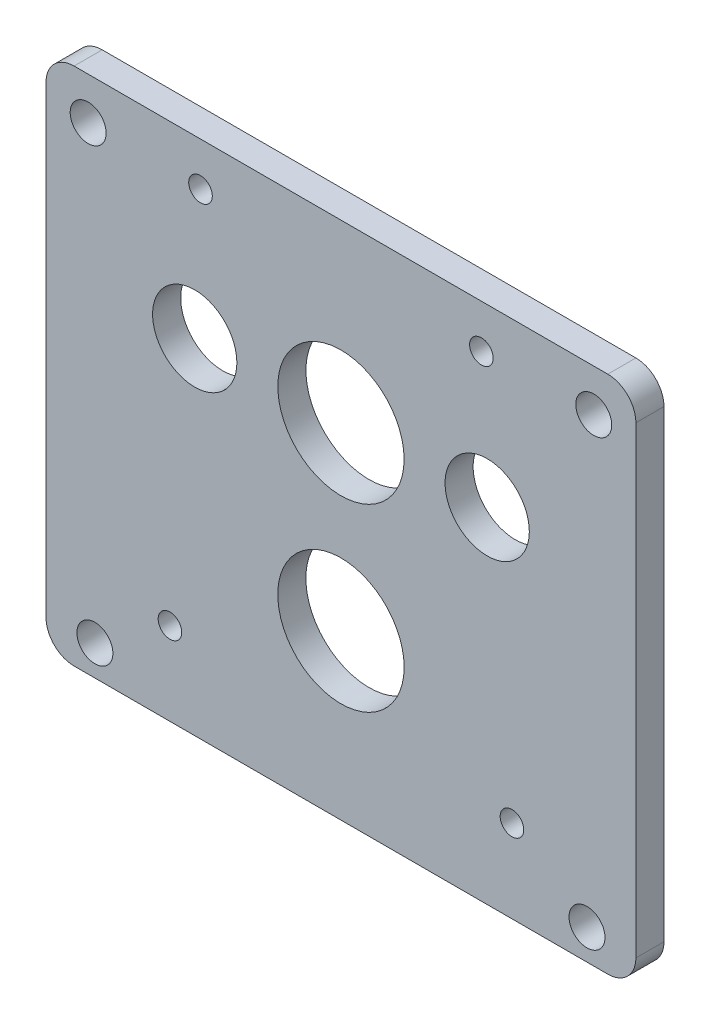
ISO-10303-21;
HEADER;
FILE_DESCRIPTION(('STEP AP214'),'2;1');
FILE_NAME('part.step','',(''),(''),'','','');
FILE_SCHEMA(('AUTOMOTIVE_DESIGN { 1 0 10303 214 1 1 1 1 }'));
ENDSEC;
DATA;
#1=APPLICATION_CONTEXT('core data for automotive mechanical design processes');
#2=APPLICATION_PROTOCOL_DEFINITION('international standard','automotive_design',2000,#1);
#3=PRODUCT_CONTEXT('',#1,'mechanical');
#4=PRODUCT('Part','Part','',(#3));
#5=PRODUCT_RELATED_PRODUCT_CATEGORY('part','',(#4));
#6=PRODUCT_DEFINITION_FORMATION('','',#4);
#7=PRODUCT_DEFINITION_CONTEXT('part definition',#1,'design');
#8=PRODUCT_DEFINITION('design','',#6,#7);
#9=PRODUCT_DEFINITION_SHAPE('','',#8);
#10=(LENGTH_UNIT() NAMED_UNIT(*) SI_UNIT(.MILLI.,.METRE.));
#11=(NAMED_UNIT(*) PLANE_ANGLE_UNIT() SI_UNIT($,.RADIAN.));
#12=(NAMED_UNIT(*) SI_UNIT($,.STERADIAN.) SOLID_ANGLE_UNIT());
#13=UNCERTAINTY_MEASURE_WITH_UNIT(LENGTH_MEASURE(1.E-05),#10,'distance_accuracy_value','');
#14=(GEOMETRIC_REPRESENTATION_CONTEXT(3) GLOBAL_UNCERTAINTY_ASSIGNED_CONTEXT((#13)) GLOBAL_UNIT_ASSIGNED_CONTEXT((#10,
#11,#12)) REPRESENTATION_CONTEXT('',''));
#15=CARTESIAN_POINT('',(0.,0.,0.));
#16=DIRECTION('',(0.,0.,1.));
#17=DIRECTION('',(1.,0.,0.));
#18=AXIS2_PLACEMENT_3D('',#15,#16,#17);
#19=CARTESIAN_POINT('',(0.,0.,3.175));
#20=DIRECTION('',(0.,0.,1.));
#21=DIRECTION('',(1.,0.,0.));
#22=AXIS2_PLACEMENT_3D('',#19,#20,#21);
#23=PLANE('',#22);
#24=CARTESIAN_POINT('',(57.15,70.8914,3.175));
#25=DIRECTION('',(0.,0.,1.));
#26=DIRECTION('',(1.,0.,0.));
#27=AXIS2_PLACEMENT_3D('',#24,#25,#26);
#28=CIRCLE('',#27,4.064);
#29=CARTESIAN_POINT('',(61.214,70.8914,3.175));
#30=VERTEX_POINT('',#29);
#31=EDGE_CURVE('E235',#30,#30,#28,.T.);
#32=ORIENTED_EDGE('',*,*,#31,.F.);
#33=EDGE_LOOP('',(#32));
#34=FACE_BOUND('',#33,.T.);
#35=CARTESIAN_POINT('',(31.75,70.5866,3.175));
#36=DIRECTION('',(0.,0.,1.));
#37=DIRECTION('',(1.,0.,0.));
#38=AXIS2_PLACEMENT_3D('',#35,#36,#37);
#39=CIRCLE('',#38,2.667);
#40=CARTESIAN_POINT('',(34.417,70.5866,3.175));
#41=VERTEX_POINT('',#40);
#42=EDGE_CURVE('E223',#41,#41,#39,.T.);
#43=ORIENTED_EDGE('',*,*,#42,.F.);
#44=EDGE_LOOP('',(#43));
#45=FACE_BOUND('',#44,.T.);
#46=CARTESIAN_POINT('',(-38.6588,-18.3134,3.175));
#47=DIRECTION('',(0.,0.,1.));
#48=DIRECTION('',(1.,0.,0.));
#49=AXIS2_PLACEMENT_3D('',#46,#47,#48);
#50=CIRCLE('',#49,2.667);
#51=CARTESIAN_POINT('',(-35.9918,-18.3134,3.175));
#52=VERTEX_POINT('',#51);
#53=EDGE_CURVE('E211',#52,#52,#50,.T.);
#54=ORIENTED_EDGE('',*,*,#53,.F.);
#55=EDGE_LOOP('',(#54));
#56=FACE_BOUND('',#55,.T.);
#57=CARTESIAN_POINT('',(-57.15,70.8914,3.175));
#58=DIRECTION('',(0.,0.,1.));
#59=DIRECTION('',(1.,0.,0.));
#60=AXIS2_PLACEMENT_3D('',#57,#58,#59);
#61=CIRCLE('',#60,4.064);
#62=CARTESIAN_POINT('',(-53.086,70.8914,3.175));
#63=VERTEX_POINT('',#62);
#64=EDGE_CURVE('E199',#63,#63,#61,.T.);
#65=ORIENTED_EDGE('',*,*,#64,.F.);
#66=EDGE_LOOP('',(#65));
#67=FACE_BOUND('',#66,.T.);
#68=CARTESIAN_POINT('',(-33.0581,40.7162,3.175));
#69=DIRECTION('',(0.,0.,1.));
#70=DIRECTION('',(1.,0.,0.));
#71=AXIS2_PLACEMENT_3D('',#68,#69,#70);
#72=CIRCLE('',#71,9.525);
#73=CARTESIAN_POINT('',(-23.5331,40.7162,3.175));
#74=VERTEX_POINT('',#73);
#75=EDGE_CURVE('E187',#74,#74,#72,.T.);
#76=ORIENTED_EDGE('',*,*,#75,.F.);
#77=EDGE_LOOP('',(#76));
#78=FACE_BOUND('',#77,.T.);
#79=CARTESIAN_POINT('',(0.,40.7162,3.175));
#80=DIRECTION('',(0.,0.,1.));
#81=DIRECTION('',(1.,0.,0.));
#82=AXIS2_PLACEMENT_3D('',#79,#80,#81);
#83=CIRCLE('',#82,14.2748);
#84=CARTESIAN_POINT('',(14.2748,40.7162,3.175));
#85=VERTEX_POINT('',#84);
#86=EDGE_CURVE('E133',#85,#85,#83,.T.);
#87=ORIENTED_EDGE('',*,*,#86,.F.);
#88=EDGE_LOOP('',(#87));
#89=FACE_BOUND('',#88,.T.);
#90=DIRECTION('',(0.,1.,0.));
#91=VECTOR('',#90,1.);
#92=CARTESIAN_POINT('',(66.675,80.4164,3.175));
#93=LINE('',#92,#91);
#94=CARTESIAN_POINT('',(66.675,-30.7086,3.175));
#95=VERTEX_POINT('',#94);
#96=CARTESIAN_POINT('',(66.675,74.0664,3.175));
#97=VERTEX_POINT('',#96);
#98=EDGE_CURVE('E138',#95,#97,#93,.T.);
#99=ORIENTED_EDGE('',*,*,#98,.T.);
#100=CARTESIAN_POINT('',(60.325,74.0664,3.175));
#101=DIRECTION('',(0.,0.,1.));
#102=DIRECTION('',(1.,0.,0.));
#103=AXIS2_PLACEMENT_3D('',#100,#101,#102);
#104=CIRCLE('',#103,6.35);
#105=CARTESIAN_POINT('',(60.325,80.4164,3.175));
#106=VERTEX_POINT('',#105);
#107=EDGE_CURVE('E153',#97,#106,#104,.T.);
#108=ORIENTED_EDGE('',*,*,#107,.T.);
#109=DIRECTION('',(-1.,0.,0.));
#110=VECTOR('',#109,1.);
#111=CARTESIAN_POINT('',(-66.675,80.4164,3.175));
#112=LINE('',#111,#110);
#113=CARTESIAN_POINT('',(-60.325,80.4164,3.175));
#114=VERTEX_POINT('',#113);
#115=EDGE_CURVE('E120',#106,#114,#112,.T.);
#116=ORIENTED_EDGE('',*,*,#115,.T.);
#117=CARTESIAN_POINT('',(-60.325,74.0664,3.175));
#118=DIRECTION('',(0.,0.,1.));
#119=DIRECTION('',(1.,0.,0.));
#120=AXIS2_PLACEMENT_3D('',#117,#118,#119);
#121=CIRCLE('',#120,6.35);
#122=CARTESIAN_POINT('',(-66.675,74.0664,3.175));
#123=VERTEX_POINT('',#122);
#124=EDGE_CURVE('E148',#114,#123,#121,.T.);
#125=ORIENTED_EDGE('',*,*,#124,.T.);
#126=DIRECTION('',(0.,-1.,0.));
#127=VECTOR('',#126,1.);
#128=CARTESIAN_POINT('',(-66.675,80.4164,3.175));
#129=LINE('',#128,#127);
#130=CARTESIAN_POINT('',(-66.675,-30.7086,3.175));
#131=VERTEX_POINT('',#130);
#132=EDGE_CURVE('E164',#123,#131,#129,.T.);
#133=ORIENTED_EDGE('',*,*,#132,.T.);
#134=CARTESIAN_POINT('',(-60.325,-30.7086,3.175));
#135=DIRECTION('',(0.,0.,1.));
#136=DIRECTION('',(1.,0.,0.));
#137=AXIS2_PLACEMENT_3D('',#134,#135,#136);
#138=CIRCLE('',#137,6.35);
#139=CARTESIAN_POINT('',(-60.325,-37.0586,3.175));
#140=VERTEX_POINT('',#139);
#141=EDGE_CURVE('E56',#131,#140,#138,.T.);
#142=ORIENTED_EDGE('',*,*,#141,.T.);
#143=DIRECTION('',(1.,0.,0.));
#144=VECTOR('',#143,1.);
#145=CARTESIAN_POINT('',(-66.675,-37.0586,3.175));
#146=LINE('',#145,#144);
#147=CARTESIAN_POINT('',(60.325,-37.0586,3.175));
#148=VERTEX_POINT('',#147);
#149=EDGE_CURVE('E139',#140,#148,#146,.T.);
#150=ORIENTED_EDGE('',*,*,#149,.T.);
#151=CARTESIAN_POINT('',(60.325,-30.7086,3.175));
#152=DIRECTION('',(0.,0.,1.));
#153=DIRECTION('',(1.,0.,0.));
#154=AXIS2_PLACEMENT_3D('',#151,#152,#153);
#155=CIRCLE('',#154,6.35);
#156=EDGE_CURVE('E151',#148,#95,#155,.T.);
#157=ORIENTED_EDGE('',*,*,#156,.T.);
#158=EDGE_LOOP('',(#99,#108,#116,#125,#133,#142,#150,#157));
#159=FACE_BOUND('',#158,.T.);
#160=CARTESIAN_POINT('',(33.0581,40.7162,3.175));
#161=DIRECTION('',(0.,0.,1.));
#162=DIRECTION('',(1.,0.,0.));
#163=AXIS2_PLACEMENT_3D('',#160,#161,#162);
#164=CIRCLE('',#163,9.52500000000001);
#165=CARTESIAN_POINT('',(42.5831,40.7162,3.175));
#166=VERTEX_POINT('',#165);
#167=EDGE_CURVE('E181',#166,#166,#164,.T.);
#168=ORIENTED_EDGE('',*,*,#167,.F.);
#169=EDGE_LOOP('',(#168));
#170=FACE_BOUND('',#169,.T.);
#171=CARTESIAN_POINT('',(0.,0.,3.175));
#172=DIRECTION('',(0.,0.,1.));
#173=DIRECTION('',(1.,0.,0.));
#174=AXIS2_PLACEMENT_3D('',#171,#172,#173);
#175=CIRCLE('',#174,14.2875);
#176=CARTESIAN_POINT('',(14.2875,0.,3.175));
#177=VERTEX_POINT('',#176);
#178=EDGE_CURVE('E193',#177,#177,#175,.T.);
#179=ORIENTED_EDGE('',*,*,#178,.F.);
#180=EDGE_LOOP('',(#179));
#181=FACE_BOUND('',#180,.T.);
#182=CARTESIAN_POINT('',(38.6588,-18.3134,3.175));
#183=DIRECTION('',(0.,0.,1.));
#184=DIRECTION('',(1.,0.,0.));
#185=AXIS2_PLACEMENT_3D('',#182,#183,#184);
#186=CIRCLE('',#185,2.667);
#187=CARTESIAN_POINT('',(41.3258,-18.3134,3.175));
#188=VERTEX_POINT('',#187);
#189=EDGE_CURVE('E205',#188,#188,#186,.T.);
#190=ORIENTED_EDGE('',*,*,#189,.F.);
#191=EDGE_LOOP('',(#190));
#192=FACE_BOUND('',#191,.T.);
#193=CARTESIAN_POINT('',(-31.75,70.5866,3.175));
#194=DIRECTION('',(0.,0.,1.));
#195=DIRECTION('',(1.,0.,0.));
#196=AXIS2_PLACEMENT_3D('',#193,#194,#195);
#197=CIRCLE('',#196,2.667);
#198=CARTESIAN_POINT('',(-29.083,70.5866,3.175));
#199=VERTEX_POINT('',#198);
#200=EDGE_CURVE('E217',#199,#199,#197,.T.);
#201=ORIENTED_EDGE('',*,*,#200,.F.);
#202=EDGE_LOOP('',(#201));
#203=FACE_BOUND('',#202,.T.);
#204=CARTESIAN_POINT('',(-55.626,-30.2006,3.175));
#205=DIRECTION('',(0.,0.,1.));
#206=DIRECTION('',(1.,0.,0.));
#207=AXIS2_PLACEMENT_3D('',#204,#205,#206);
#208=CIRCLE('',#207,4.06400000000001);
#209=CARTESIAN_POINT('',(-51.562,-30.2006,3.175));
#210=VERTEX_POINT('',#209);
#211=EDGE_CURVE('E229',#210,#210,#208,.T.);
#212=ORIENTED_EDGE('',*,*,#211,.F.);
#213=EDGE_LOOP('',(#212));
#214=FACE_BOUND('',#213,.T.);
#215=CARTESIAN_POINT('',(55.626,-30.2006,3.175));
#216=DIRECTION('',(0.,0.,1.));
#217=DIRECTION('',(1.,0.,0.));
#218=AXIS2_PLACEMENT_3D('',#215,#216,#217);
#219=CIRCLE('',#218,4.064);
#220=CARTESIAN_POINT('',(59.69,-30.2006,3.175));
#221=VERTEX_POINT('',#220);
#222=EDGE_CURVE('E241',#221,#221,#219,.T.);
#223=ORIENTED_EDGE('',*,*,#222,.F.);
#224=EDGE_LOOP('',(#223));
#225=FACE_BOUND('',#224,.T.);
#226=ADVANCED_FACE('F34',(#34,#45,#56,#67,#78,#89,#159,#170,#181,#192,#203,#214,#225),#23,.T.);
#227=CARTESIAN_POINT('',(0.,0.,-3.175));
#228=DIRECTION('',(0.,0.,1.));
#229=DIRECTION('',(1.,0.,0.));
#230=AXIS2_PLACEMENT_3D('',#227,#228,#229);
#231=PLANE('',#230);
#232=DIRECTION('',(-1.,0.,0.));
#233=VECTOR('',#232,1.);
#234=CARTESIAN_POINT('',(-66.675,80.4164,-3.175));
#235=LINE('',#234,#233);
#236=CARTESIAN_POINT('',(60.325,80.4164,-3.175));
#237=VERTEX_POINT('',#236);
#238=CARTESIAN_POINT('',(-60.325,80.4164,-3.175));
#239=VERTEX_POINT('',#238);
#240=EDGE_CURVE('E117',#237,#239,#235,.T.);
#241=ORIENTED_EDGE('',*,*,#240,.F.);
#242=CARTESIAN_POINT('',(60.325,74.0664,-3.175));
#243=DIRECTION('',(0.,0.,1.));
#244=DIRECTION('',(1.,0.,0.));
#245=AXIS2_PLACEMENT_3D('',#242,#243,#244);
#246=CIRCLE('',#245,6.35);
#247=CARTESIAN_POINT('',(66.675,74.0664,-3.175));
#248=VERTEX_POINT('',#247);
#249=EDGE_CURVE('E100',#237,#248,#246,.F.);
#250=ORIENTED_EDGE('',*,*,#249,.T.);
#251=DIRECTION('',(0.,1.,0.));
#252=VECTOR('',#251,1.);
#253=CARTESIAN_POINT('',(66.675,80.4164,-3.175));
#254=LINE('',#253,#252);
#255=CARTESIAN_POINT('',(66.675,-30.7086,-3.175));
#256=VERTEX_POINT('',#255);
#257=EDGE_CURVE('E128',#256,#248,#254,.T.);
#258=ORIENTED_EDGE('',*,*,#257,.F.);
#259=CARTESIAN_POINT('',(60.325,-30.7086,-3.175));
#260=DIRECTION('',(0.,0.,1.));
#261=DIRECTION('',(1.,0.,0.));
#262=AXIS2_PLACEMENT_3D('',#259,#260,#261);
#263=CIRCLE('',#262,6.35);
#264=CARTESIAN_POINT('',(60.325,-37.0586,-3.175));
#265=VERTEX_POINT('',#264);
#266=EDGE_CURVE('E111',#256,#265,#263,.F.);
#267=ORIENTED_EDGE('',*,*,#266,.T.);
#268=DIRECTION('',(1.,0.,0.));
#269=VECTOR('',#268,1.);
#270=CARTESIAN_POINT('',(-66.675,-37.0586,-3.175));
#271=LINE('',#270,#269);
#272=CARTESIAN_POINT('',(-60.325,-37.0586,-3.175));
#273=VERTEX_POINT('',#272);
#274=EDGE_CURVE('E131',#273,#265,#271,.T.);
#275=ORIENTED_EDGE('',*,*,#274,.F.);
#276=CARTESIAN_POINT('',(-60.325,-30.7086,-3.175));
#277=DIRECTION('',(0.,0.,1.));
#278=DIRECTION('',(1.,0.,0.));
#279=AXIS2_PLACEMENT_3D('',#276,#277,#278);
#280=CIRCLE('',#279,6.35);
#281=CARTESIAN_POINT('',(-66.675,-30.7086,-3.175));
#282=VERTEX_POINT('',#281);
#283=EDGE_CURVE('E142',#273,#282,#280,.F.);
#284=ORIENTED_EDGE('',*,*,#283,.T.);
#285=DIRECTION('',(0.,-1.,0.));
#286=VECTOR('',#285,1.);
#287=CARTESIAN_POINT('',(-66.675,80.4164,-3.175));
#288=LINE('',#287,#286);
#289=CARTESIAN_POINT('',(-66.675,74.0664,-3.175));
#290=VERTEX_POINT('',#289);
#291=EDGE_CURVE('E127',#290,#282,#288,.T.);
#292=ORIENTED_EDGE('',*,*,#291,.F.);
#293=CARTESIAN_POINT('',(-60.325,74.0664,-3.175));
#294=DIRECTION('',(0.,0.,1.));
#295=DIRECTION('',(1.,0.,0.));
#296=AXIS2_PLACEMENT_3D('',#293,#294,#295);
#297=CIRCLE('',#296,6.35);
#298=EDGE_CURVE('E121',#290,#239,#297,.F.);
#299=ORIENTED_EDGE('',*,*,#298,.T.);
#300=EDGE_LOOP('',(#241,#250,#258,#267,#275,#284,#292,#299));
#301=FACE_BOUND('',#300,.T.);
#302=CARTESIAN_POINT('',(0.,40.7162,-3.175));
#303=DIRECTION('',(0.,0.,1.));
#304=DIRECTION('',(1.,0.,0.));
#305=AXIS2_PLACEMENT_3D('',#302,#303,#304);
#306=CIRCLE('',#305,14.2748);
#307=CARTESIAN_POINT('',(14.2748,40.7162,-3.175));
#308=VERTEX_POINT('',#307);
#309=EDGE_CURVE('E178',#308,#308,#306,.T.);
#310=ORIENTED_EDGE('',*,*,#309,.T.);
#311=EDGE_LOOP('',(#310));
#312=FACE_BOUND('',#311,.T.);
#313=CARTESIAN_POINT('',(33.0581,40.7162,-3.175));
#314=DIRECTION('',(0.,0.,1.));
#315=DIRECTION('',(1.,0.,0.));
#316=AXIS2_PLACEMENT_3D('',#313,#314,#315);
#317=CIRCLE('',#316,9.52500000000001);
#318=CARTESIAN_POINT('',(42.5831,40.7162,-3.175));
#319=VERTEX_POINT('',#318);
#320=EDGE_CURVE('E184',#319,#319,#317,.T.);
#321=ORIENTED_EDGE('',*,*,#320,.T.);
#322=EDGE_LOOP('',(#321));
#323=FACE_BOUND('',#322,.T.);
#324=CARTESIAN_POINT('',(-33.0581,40.7162,-3.175));
#325=DIRECTION('',(0.,0.,1.));
#326=DIRECTION('',(1.,0.,0.));
#327=AXIS2_PLACEMENT_3D('',#324,#325,#326);
#328=CIRCLE('',#327,9.525);
#329=CARTESIAN_POINT('',(-23.5331,40.7162,-3.175));
#330=VERTEX_POINT('',#329);
#331=EDGE_CURVE('E190',#330,#330,#328,.T.);
#332=ORIENTED_EDGE('',*,*,#331,.T.);
#333=EDGE_LOOP('',(#332));
#334=FACE_BOUND('',#333,.T.);
#335=CARTESIAN_POINT('',(0.,0.,-3.175));
#336=DIRECTION('',(0.,0.,1.));
#337=DIRECTION('',(1.,0.,0.));
#338=AXIS2_PLACEMENT_3D('',#335,#336,#337);
#339=CIRCLE('',#338,14.2875);
#340=CARTESIAN_POINT('',(14.2875,0.,-3.175));
#341=VERTEX_POINT('',#340);
#342=EDGE_CURVE('E196',#341,#341,#339,.T.);
#343=ORIENTED_EDGE('',*,*,#342,.T.);
#344=EDGE_LOOP('',(#343));
#345=FACE_BOUND('',#344,.T.);
#346=CARTESIAN_POINT('',(-57.15,70.8914,-3.175));
#347=DIRECTION('',(0.,0.,1.));
#348=DIRECTION('',(1.,0.,0.));
#349=AXIS2_PLACEMENT_3D('',#346,#347,#348);
#350=CIRCLE('',#349,4.064);
#351=CARTESIAN_POINT('',(-53.086,70.8914,-3.175));
#352=VERTEX_POINT('',#351);
#353=EDGE_CURVE('E202',#352,#352,#350,.T.);
#354=ORIENTED_EDGE('',*,*,#353,.T.);
#355=EDGE_LOOP('',(#354));
#356=FACE_BOUND('',#355,.T.);
#357=CARTESIAN_POINT('',(38.6588,-18.3134,-3.175));
#358=DIRECTION('',(0.,0.,1.));
#359=DIRECTION('',(1.,0.,0.));
#360=AXIS2_PLACEMENT_3D('',#357,#358,#359);
#361=CIRCLE('',#360,2.667);
#362=CARTESIAN_POINT('',(41.3258,-18.3134,-3.175));
#363=VERTEX_POINT('',#362);
#364=EDGE_CURVE('E208',#363,#363,#361,.T.);
#365=ORIENTED_EDGE('',*,*,#364,.T.);
#366=EDGE_LOOP('',(#365));
#367=FACE_BOUND('',#366,.T.);
#368=CARTESIAN_POINT('',(-38.6588,-18.3134,-3.175));
#369=DIRECTION('',(0.,0.,1.));
#370=DIRECTION('',(1.,0.,0.));
#371=AXIS2_PLACEMENT_3D('',#368,#369,#370);
#372=CIRCLE('',#371,2.667);
#373=CARTESIAN_POINT('',(-35.9918,-18.3134,-3.175));
#374=VERTEX_POINT('',#373);
#375=EDGE_CURVE('E214',#374,#374,#372,.T.);
#376=ORIENTED_EDGE('',*,*,#375,.T.);
#377=EDGE_LOOP('',(#376));
#378=FACE_BOUND('',#377,.T.);
#379=CARTESIAN_POINT('',(-31.75,70.5866,-3.175));
#380=DIRECTION('',(0.,0.,1.));
#381=DIRECTION('',(1.,0.,0.));
#382=AXIS2_PLACEMENT_3D('',#379,#380,#381);
#383=CIRCLE('',#382,2.667);
#384=CARTESIAN_POINT('',(-29.083,70.5866,-3.175));
#385=VERTEX_POINT('',#384);
#386=EDGE_CURVE('E220',#385,#385,#383,.T.);
#387=ORIENTED_EDGE('',*,*,#386,.T.);
#388=EDGE_LOOP('',(#387));
#389=FACE_BOUND('',#388,.T.);
#390=CARTESIAN_POINT('',(31.75,70.5866,-3.175));
#391=DIRECTION('',(0.,0.,1.));
#392=DIRECTION('',(1.,0.,0.));
#393=AXIS2_PLACEMENT_3D('',#390,#391,#392);
#394=CIRCLE('',#393,2.667);
#395=CARTESIAN_POINT('',(34.417,70.5866,-3.175));
#396=VERTEX_POINT('',#395);
#397=EDGE_CURVE('E226',#396,#396,#394,.T.);
#398=ORIENTED_EDGE('',*,*,#397,.T.);
#399=EDGE_LOOP('',(#398));
#400=FACE_BOUND('',#399,.T.);
#401=CARTESIAN_POINT('',(-55.626,-30.2006,-3.175));
#402=DIRECTION('',(0.,0.,1.));
#403=DIRECTION('',(1.,0.,0.));
#404=AXIS2_PLACEMENT_3D('',#401,#402,#403);
#405=CIRCLE('',#404,4.06400000000001);
#406=CARTESIAN_POINT('',(-51.562,-30.2006,-3.175));
#407=VERTEX_POINT('',#406);
#408=EDGE_CURVE('E232',#407,#407,#405,.T.);
#409=ORIENTED_EDGE('',*,*,#408,.T.);
#410=EDGE_LOOP('',(#409));
#411=FACE_BOUND('',#410,.T.);
#412=CARTESIAN_POINT('',(57.15,70.8914,-3.175));
#413=DIRECTION('',(0.,0.,1.));
#414=DIRECTION('',(1.,0.,0.));
#415=AXIS2_PLACEMENT_3D('',#412,#413,#414);
#416=CIRCLE('',#415,4.064);
#417=CARTESIAN_POINT('',(61.214,70.8914,-3.175));
#418=VERTEX_POINT('',#417);
#419=EDGE_CURVE('E238',#418,#418,#416,.T.);
#420=ORIENTED_EDGE('',*,*,#419,.T.);
#421=EDGE_LOOP('',(#420));
#422=FACE_BOUND('',#421,.T.);
#423=CARTESIAN_POINT('',(55.626,-30.2006,-3.175));
#424=DIRECTION('',(0.,0.,1.));
#425=DIRECTION('',(1.,0.,0.));
#426=AXIS2_PLACEMENT_3D('',#423,#424,#425);
#427=CIRCLE('',#426,4.064);
#428=CARTESIAN_POINT('',(59.69,-30.2006,-3.175));
#429=VERTEX_POINT('',#428);
#430=EDGE_CURVE('E244',#429,#429,#427,.T.);
#431=ORIENTED_EDGE('',*,*,#430,.T.);
#432=EDGE_LOOP('',(#431));
#433=FACE_BOUND('',#432,.T.);
#434=ADVANCED_FACE('F124',(#301,#312,#323,#334,#345,#356,#367,#378,#389,#400,#411,#422,#433),
#231,.F.);
#435=CARTESIAN_POINT('',(66.675,80.4164,3.175));
#436=DIRECTION('',(-1.,0.,0.));
#437=DIRECTION('',(0.,0.,1.));
#438=AXIS2_PLACEMENT_3D('',#435,#436,#437);
#439=PLANE('',#438);
#440=ORIENTED_EDGE('',*,*,#257,.T.);
#441=DIRECTION('',(0.,0.,-1.));
#442=VECTOR('',#441,1.);
#443=CARTESIAN_POINT('',(66.675,74.0664,3.175));
#444=LINE('',#443,#442);
#445=EDGE_CURVE('E105',#248,#97,#444,.F.);
#446=ORIENTED_EDGE('',*,*,#445,.T.);
#447=ORIENTED_EDGE('',*,*,#98,.F.);
#448=DIRECTION('',(0.,0.,-1.));
#449=VECTOR('',#448,1.);
#450=CARTESIAN_POINT('',(66.675,-30.7086,3.175));
#451=LINE('',#450,#449);
#452=EDGE_CURVE('E110',#95,#256,#451,.T.);
#453=ORIENTED_EDGE('',*,*,#452,.T.);
#454=EDGE_LOOP('',(#440,#446,#447,#453));
#455=FACE_BOUND('',#454,.T.);
#456=ADVANCED_FACE('F259',(#455),#439,.F.);
#457=CARTESIAN_POINT('',(-66.675,80.4164,3.175));
#458=DIRECTION('',(0.,-1.,0.));
#459=DIRECTION('',(0.,0.,-1.));
#460=AXIS2_PLACEMENT_3D('',#457,#458,#459);
#461=PLANE('',#460);
#462=ORIENTED_EDGE('',*,*,#115,.F.);
#463=DIRECTION('',(0.,0.,-1.));
#464=VECTOR('',#463,1.);
#465=CARTESIAN_POINT('',(60.325,80.4164,3.175));
#466=LINE('',#465,#464);
#467=EDGE_CURVE('E104',#106,#237,#466,.T.);
#468=ORIENTED_EDGE('',*,*,#467,.T.);
#469=ORIENTED_EDGE('',*,*,#240,.T.);
#470=DIRECTION('',(0.,0.,-1.));
#471=VECTOR('',#470,1.);
#472=CARTESIAN_POINT('',(-60.325,80.4164,3.175));
#473=LINE('',#472,#471);
#474=EDGE_CURVE('E122',#239,#114,#473,.F.);
#475=ORIENTED_EDGE('',*,*,#474,.T.);
#476=EDGE_LOOP('',(#462,#468,#469,#475));
#477=FACE_BOUND('',#476,.T.);
#478=ADVANCED_FACE('F116',(#477),#461,.F.);
#479=CARTESIAN_POINT('',(-66.675,80.4164,3.175));
#480=DIRECTION('',(1.,0.,0.));
#481=DIRECTION('',(0.,1.,0.));
#482=AXIS2_PLACEMENT_3D('',#479,#480,#481);
#483=PLANE('',#482);
#484=ORIENTED_EDGE('',*,*,#291,.T.);
#485=DIRECTION('',(0.,0.,-1.));
#486=VECTOR('',#485,1.);
#487=CARTESIAN_POINT('',(-66.675,-30.7086,3.175));
#488=LINE('',#487,#486);
#489=EDGE_CURVE('E11',#282,#131,#488,.F.);
#490=ORIENTED_EDGE('',*,*,#489,.T.);
#491=ORIENTED_EDGE('',*,*,#132,.F.);
#492=DIRECTION('',(0.,0.,-1.));
#493=VECTOR('',#492,1.);
#494=CARTESIAN_POINT('',(-66.675,74.0664,3.175));
#495=LINE('',#494,#493);
#496=EDGE_CURVE('E42',#123,#290,#495,.T.);
#497=ORIENTED_EDGE('',*,*,#496,.T.);
#498=EDGE_LOOP('',(#484,#490,#491,#497));
#499=FACE_BOUND('',#498,.T.);
#500=ADVANCED_FACE('F162',(#499),#483,.F.);
#501=CARTESIAN_POINT('',(-66.675,-37.0586,3.175));
#502=DIRECTION('',(0.,1.,0.));
#503=DIRECTION('',(0.,0.,1.));
#504=AXIS2_PLACEMENT_3D('',#501,#502,#503);
#505=PLANE('',#504);
#506=ORIENTED_EDGE('',*,*,#274,.T.);
#507=DIRECTION('',(0.,0.,-1.));
#508=VECTOR('',#507,1.);
#509=CARTESIAN_POINT('',(60.325,-37.0586,3.175));
#510=LINE('',#509,#508);
#511=EDGE_CURVE('E49',#265,#148,#510,.F.);
#512=ORIENTED_EDGE('',*,*,#511,.T.);
#513=ORIENTED_EDGE('',*,*,#149,.F.);
#514=DIRECTION('',(0.,0.,-1.));
#515=VECTOR('',#514,1.);
#516=CARTESIAN_POINT('',(-60.325,-37.0586,3.175));
#517=LINE('',#516,#515);
#518=EDGE_CURVE('E155',#140,#273,#517,.T.);
#519=ORIENTED_EDGE('',*,*,#518,.T.);
#520=EDGE_LOOP('',(#506,#512,#513,#519));
#521=FACE_BOUND('',#520,.T.);
#522=ADVANCED_FACE('F171',(#521),#505,.F.);
#523=CARTESIAN_POINT('',(0.,40.7162,3.175));
#524=DIRECTION('',(0.,0.,-1.));
#525=DIRECTION('',(-1.,0.,0.));
#526=AXIS2_PLACEMENT_3D('',#523,#524,#525);
#527=CYLINDRICAL_SURFACE('',#526,14.2748);
#528=ORIENTED_EDGE('',*,*,#86,.T.);
#529=EDGE_LOOP('',(#528));
#530=FACE_BOUND('',#529,.T.);
#531=ORIENTED_EDGE('',*,*,#309,.F.);
#532=EDGE_LOOP('',(#531));
#533=FACE_BOUND('',#532,.T.);
#534=ADVANCED_FACE('F264',(#530,#533),#527,.F.);
#535=CARTESIAN_POINT('',(33.0581,40.7162,3.175));
#536=DIRECTION('',(0.,0.,-1.));
#537=DIRECTION('',(-1.,0.,0.));
#538=AXIS2_PLACEMENT_3D('',#535,#536,#537);
#539=CYLINDRICAL_SURFACE('',#538,9.52500000000001);
#540=ORIENTED_EDGE('',*,*,#167,.T.);
#541=EDGE_LOOP('',(#540));
#542=FACE_BOUND('',#541,.T.);
#543=ORIENTED_EDGE('',*,*,#320,.F.);
#544=EDGE_LOOP('',(#543));
#545=FACE_BOUND('',#544,.T.);
#546=ADVANCED_FACE('F345',(#542,#545),#539,.F.);
#547=CARTESIAN_POINT('',(-33.0581,40.7162,3.175));
#548=DIRECTION('',(0.,0.,-1.));
#549=DIRECTION('',(-1.,0.,0.));
#550=AXIS2_PLACEMENT_3D('',#547,#548,#549);
#551=CYLINDRICAL_SURFACE('',#550,9.525);
#552=ORIENTED_EDGE('',*,*,#75,.T.);
#553=EDGE_LOOP('',(#552));
#554=FACE_BOUND('',#553,.T.);
#555=ORIENTED_EDGE('',*,*,#331,.F.);
#556=EDGE_LOOP('',(#555));
#557=FACE_BOUND('',#556,.T.);
#558=ADVANCED_FACE('F342',(#554,#557),#551,.F.);
#559=CARTESIAN_POINT('',(0.,0.,3.175));
#560=DIRECTION('',(0.,0.,-1.));
#561=DIRECTION('',(-1.,0.,0.));
#562=AXIS2_PLACEMENT_3D('',#559,#560,#561);
#563=CYLINDRICAL_SURFACE('',#562,14.2875);
#564=ORIENTED_EDGE('',*,*,#178,.T.);
#565=EDGE_LOOP('',(#564));
#566=FACE_BOUND('',#565,.T.);
#567=ORIENTED_EDGE('',*,*,#342,.F.);
#568=EDGE_LOOP('',(#567));
#569=FACE_BOUND('',#568,.T.);
#570=ADVANCED_FACE('F338',(#566,#569),#563,.F.);
#571=CARTESIAN_POINT('',(-57.15,70.8914,3.175));
#572=DIRECTION('',(0.,0.,-1.));
#573=DIRECTION('',(-1.,0.,0.));
#574=AXIS2_PLACEMENT_3D('',#571,#572,#573);
#575=CYLINDRICAL_SURFACE('',#574,4.064);
#576=ORIENTED_EDGE('',*,*,#64,.T.);
#577=EDGE_LOOP('',(#576));
#578=FACE_BOUND('',#577,.T.);
#579=ORIENTED_EDGE('',*,*,#353,.F.);
#580=EDGE_LOOP('',(#579));
#581=FACE_BOUND('',#580,.T.);
#582=ADVANCED_FACE('F334',(#578,#581),#575,.F.);
#583=CARTESIAN_POINT('',(38.6588,-18.3134,3.175));
#584=DIRECTION('',(0.,0.,-1.));
#585=DIRECTION('',(-1.,0.,0.));
#586=AXIS2_PLACEMENT_3D('',#583,#584,#585);
#587=CYLINDRICAL_SURFACE('',#586,2.667);
#588=ORIENTED_EDGE('',*,*,#189,.T.);
#589=EDGE_LOOP('',(#588));
#590=FACE_BOUND('',#589,.T.);
#591=ORIENTED_EDGE('',*,*,#364,.F.);
#592=EDGE_LOOP('',(#591));
#593=FACE_BOUND('',#592,.T.);
#594=ADVANCED_FACE('F330',(#590,#593),#587,.F.);
#595=CARTESIAN_POINT('',(-38.6588,-18.3134,3.175));
#596=DIRECTION('',(0.,0.,-1.));
#597=DIRECTION('',(-1.,0.,0.));
#598=AXIS2_PLACEMENT_3D('',#595,#596,#597);
#599=CYLINDRICAL_SURFACE('',#598,2.667);
#600=ORIENTED_EDGE('',*,*,#53,.T.);
#601=EDGE_LOOP('',(#600));
#602=FACE_BOUND('',#601,.T.);
#603=ORIENTED_EDGE('',*,*,#375,.F.);
#604=EDGE_LOOP('',(#603));
#605=FACE_BOUND('',#604,.T.);
#606=ADVANCED_FACE('F326',(#602,#605),#599,.F.);
#607=CARTESIAN_POINT('',(-31.75,70.5866,3.175));
#608=DIRECTION('',(0.,0.,-1.));
#609=DIRECTION('',(-1.,0.,0.));
#610=AXIS2_PLACEMENT_3D('',#607,#608,#609);
#611=CYLINDRICAL_SURFACE('',#610,2.667);
#612=ORIENTED_EDGE('',*,*,#200,.T.);
#613=EDGE_LOOP('',(#612));
#614=FACE_BOUND('',#613,.T.);
#615=ORIENTED_EDGE('',*,*,#386,.F.);
#616=EDGE_LOOP('',(#615));
#617=FACE_BOUND('',#616,.T.);
#618=ADVANCED_FACE('F322',(#614,#617),#611,.F.);
#619=CARTESIAN_POINT('',(31.75,70.5866,3.175));
#620=DIRECTION('',(0.,0.,-1.));
#621=DIRECTION('',(-1.,0.,0.));
#622=AXIS2_PLACEMENT_3D('',#619,#620,#621);
#623=CYLINDRICAL_SURFACE('',#622,2.667);
#624=ORIENTED_EDGE('',*,*,#42,.T.);
#625=EDGE_LOOP('',(#624));
#626=FACE_BOUND('',#625,.T.);
#627=ORIENTED_EDGE('',*,*,#397,.F.);
#628=EDGE_LOOP('',(#627));
#629=FACE_BOUND('',#628,.T.);
#630=ADVANCED_FACE('F304',(#626,#629),#623,.F.);
#631=CARTESIAN_POINT('',(-55.626,-30.2006,3.175));
#632=DIRECTION('',(0.,0.,-1.));
#633=DIRECTION('',(-1.,0.,0.));
#634=AXIS2_PLACEMENT_3D('',#631,#632,#633);
#635=CYLINDRICAL_SURFACE('',#634,4.06400000000001);
#636=ORIENTED_EDGE('',*,*,#211,.T.);
#637=EDGE_LOOP('',(#636));
#638=FACE_BOUND('',#637,.T.);
#639=ORIENTED_EDGE('',*,*,#408,.F.);
#640=EDGE_LOOP('',(#639));
#641=FACE_BOUND('',#640,.T.);
#642=ADVANCED_FACE('F300',(#638,#641),#635,.F.);
#643=CARTESIAN_POINT('',(57.15,70.8914,3.175));
#644=DIRECTION('',(0.,0.,-1.));
#645=DIRECTION('',(-1.,0.,0.));
#646=AXIS2_PLACEMENT_3D('',#643,#644,#645);
#647=CYLINDRICAL_SURFACE('',#646,4.064);
#648=ORIENTED_EDGE('',*,*,#31,.T.);
#649=EDGE_LOOP('',(#648));
#650=FACE_BOUND('',#649,.T.);
#651=ORIENTED_EDGE('',*,*,#419,.F.);
#652=EDGE_LOOP('',(#651));
#653=FACE_BOUND('',#652,.T.);
#654=ADVANCED_FACE('F303',(#650,#653),#647,.F.);
#655=CARTESIAN_POINT('',(55.626,-30.2006,3.175));
#656=DIRECTION('',(0.,0.,-1.));
#657=DIRECTION('',(-1.,0.,0.));
#658=AXIS2_PLACEMENT_3D('',#655,#656,#657);
#659=CYLINDRICAL_SURFACE('',#658,4.064);
#660=ORIENTED_EDGE('',*,*,#222,.T.);
#661=EDGE_LOOP('',(#660));
#662=FACE_BOUND('',#661,.T.);
#663=ORIENTED_EDGE('',*,*,#430,.F.);
#664=EDGE_LOOP('',(#663));
#665=FACE_BOUND('',#664,.T.);
#666=ADVANCED_FACE('F250',(#662,#665),#659,.F.);
#667=CARTESIAN_POINT('',(60.325,74.0664,3.175));
#668=DIRECTION('',(0.,0.,-1.));
#669=DIRECTION('',(-1.,0.,0.));
#670=AXIS2_PLACEMENT_3D('',#667,#668,#669);
#671=CYLINDRICAL_SURFACE('',#670,6.35);
#672=ORIENTED_EDGE('',*,*,#107,.F.);
#673=ORIENTED_EDGE('',*,*,#445,.F.);
#674=ORIENTED_EDGE('',*,*,#249,.F.);
#675=ORIENTED_EDGE('',*,*,#467,.F.);
#676=EDGE_LOOP('',(#672,#673,#674,#675));
#677=FACE_BOUND('',#676,.T.);
#678=ADVANCED_FACE('F103',(#677),#671,.T.);
#679=CARTESIAN_POINT('',(60.325,-30.7086,3.175));
#680=DIRECTION('',(0.,0.,-1.));
#681=DIRECTION('',(-1.,0.,0.));
#682=AXIS2_PLACEMENT_3D('',#679,#680,#681);
#683=CYLINDRICAL_SURFACE('',#682,6.35);
#684=ORIENTED_EDGE('',*,*,#156,.F.);
#685=ORIENTED_EDGE('',*,*,#511,.F.);
#686=ORIENTED_EDGE('',*,*,#266,.F.);
#687=ORIENTED_EDGE('',*,*,#452,.F.);
#688=EDGE_LOOP('',(#684,#685,#686,#687));
#689=FACE_BOUND('',#688,.T.);
#690=ADVANCED_FACE('F278',(#689),#683,.T.);
#691=CARTESIAN_POINT('',(-60.325,-30.7086,3.175));
#692=DIRECTION('',(0.,0.,-1.));
#693=DIRECTION('',(-1.,0.,0.));
#694=AXIS2_PLACEMENT_3D('',#691,#692,#693);
#695=CYLINDRICAL_SURFACE('',#694,6.35);
#696=ORIENTED_EDGE('',*,*,#141,.F.);
#697=ORIENTED_EDGE('',*,*,#489,.F.);
#698=ORIENTED_EDGE('',*,*,#283,.F.);
#699=ORIENTED_EDGE('',*,*,#518,.F.);
#700=EDGE_LOOP('',(#696,#697,#698,#699));
#701=FACE_BOUND('',#700,.T.);
#702=ADVANCED_FACE('F170',(#701),#695,.T.);
#703=CARTESIAN_POINT('',(-60.325,74.0664,3.175));
#704=DIRECTION('',(0.,0.,-1.));
#705=DIRECTION('',(-1.,0.,0.));
#706=AXIS2_PLACEMENT_3D('',#703,#704,#705);
#707=CYLINDRICAL_SURFACE('',#706,6.35);
#708=ORIENTED_EDGE('',*,*,#124,.F.);
#709=ORIENTED_EDGE('',*,*,#474,.F.);
#710=ORIENTED_EDGE('',*,*,#298,.F.);
#711=ORIENTED_EDGE('',*,*,#496,.F.);
#712=EDGE_LOOP('',(#708,#709,#710,#711));
#713=FACE_BOUND('',#712,.T.);
#714=ADVANCED_FACE('F36',(#713),#707,.T.);
#715=CLOSED_SHELL('',(#226,#434,#456,#478,#500,#522,#534,#546,#558,#570,#582,#594,#606,#618,
#630,#642,#654,#666,#678,#690,#702,#714));
#716=MANIFOLD_SOLID_BREP('B2',#715);
#717=ADVANCED_BREP_SHAPE_REPRESENTATION('',(#18,#716),#14);
#718=SHAPE_DEFINITION_REPRESENTATION(#9,#717);
ENDSEC;
END-ISO-10303-21;
